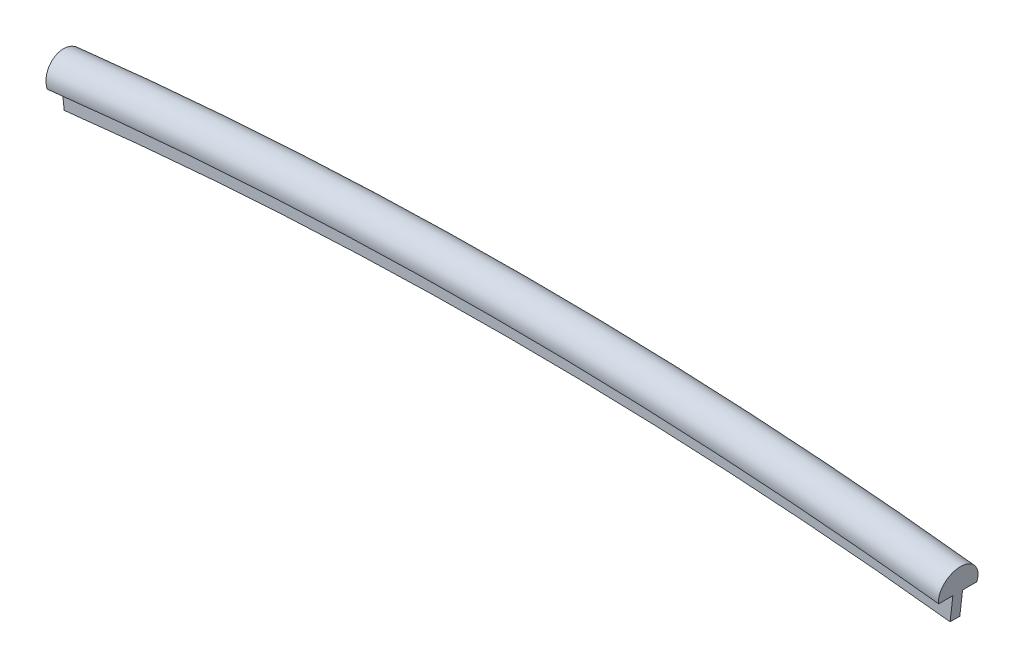
ISO-10303-21;
HEADER;
FILE_DESCRIPTION(('STEP AP214'),'2;1');
FILE_NAME('part.step','',(''),(''),'','','');
FILE_SCHEMA(('AUTOMOTIVE_DESIGN { 1 0 10303 214 1 1 1 1 }'));
ENDSEC;
DATA;
#1=APPLICATION_CONTEXT('core data for automotive mechanical design processes');
#2=APPLICATION_PROTOCOL_DEFINITION('international standard','automotive_design',2000,#1);
#3=PRODUCT_CONTEXT('',#1,'mechanical');
#4=PRODUCT('Part','Part','',(#3));
#5=PRODUCT_RELATED_PRODUCT_CATEGORY('part','',(#4));
#6=PRODUCT_DEFINITION_FORMATION('','',#4);
#7=PRODUCT_DEFINITION_CONTEXT('part definition',#1,'design');
#8=PRODUCT_DEFINITION('design','',#6,#7);
#9=PRODUCT_DEFINITION_SHAPE('','',#8);
#10=(LENGTH_UNIT() NAMED_UNIT(*) SI_UNIT(.MILLI.,.METRE.));
#11=(NAMED_UNIT(*) PLANE_ANGLE_UNIT() SI_UNIT($,.RADIAN.));
#12=(NAMED_UNIT(*) SI_UNIT($,.STERADIAN.) SOLID_ANGLE_UNIT());
#13=UNCERTAINTY_MEASURE_WITH_UNIT(LENGTH_MEASURE(1.E-05),#10,'distance_accuracy_value','');
#14=(GEOMETRIC_REPRESENTATION_CONTEXT(3) GLOBAL_UNCERTAINTY_ASSIGNED_CONTEXT((#13)) GLOBAL_UNIT_ASSIGNED_CONTEXT((#10,
#11,#12)) REPRESENTATION_CONTEXT('',''));
#15=CARTESIAN_POINT('',(0.,0.,0.));
#16=DIRECTION('',(0.,0.,1.));
#17=DIRECTION('',(1.,0.,0.));
#18=AXIS2_PLACEMENT_3D('',#15,#16,#17);
#19=CARTESIAN_POINT('',(0.,0.,70.5976415970385));
#20=DIRECTION('',(0.,0.,1.));
#21=DIRECTION('',(1.,0.,0.));
#22=AXIS2_PLACEMENT_3D('',#19,#20,#21);
#23=CYLINDRICAL_SURFACE('',#22,241.3);
#24=CARTESIAN_POINT('',(0.,0.,1.18));
#25=DIRECTION('',(0.,0.,1.));
#26=DIRECTION('',(1.,0.,0.));
#27=AXIS2_PLACEMENT_3D('',#24,#25,#26);
#28=CIRCLE('',#27,241.3);
#29=CARTESIAN_POINT('',(27.5796195249867,239.718698867771,1.18));
#30=VERTEX_POINT('',#29);
#31=CARTESIAN_POINT('',(-27.5796195249867,239.718698867771,1.18));
#32=VERTEX_POINT('',#31);
#33=EDGE_CURVE('E11',#30,#32,#28,.T.);
#34=ORIENTED_EDGE('',*,*,#33,.T.);
#35=DIRECTION('',(0.,0.,-1.));
#36=VECTOR('',#35,1.);
#37=CARTESIAN_POINT('',(-27.5796195249867,239.718698867771,1.18));
#38=LINE('',#37,#36);
#39=CARTESIAN_POINT('',(-27.5796195249867,239.718698867771,0.3));
#40=VERTEX_POINT('',#39);
#41=EDGE_CURVE('E103',#32,#40,#38,.T.);
#42=ORIENTED_EDGE('',*,*,#41,.T.);
#43=CARTESIAN_POINT('',(0.,0.,0.299999999999995));
#44=DIRECTION('',(0.,0.,1.));
#45=DIRECTION('',(1.,0.,0.));
#46=AXIS2_PLACEMENT_3D('',#43,#44,#45);
#47=CIRCLE('',#46,241.3);
#48=CARTESIAN_POINT('',(27.5796195249867,239.718698867771,0.3));
#49=VERTEX_POINT('',#48);
#50=EDGE_CURVE('E85',#49,#40,#47,.T.);
#51=ORIENTED_EDGE('',*,*,#50,.F.);
#52=DIRECTION('',(0.,0.,-1.));
#53=VECTOR('',#52,1.);
#54=CARTESIAN_POINT('',(27.5796195249867,239.718698867771,1.18));
#55=LINE('',#54,#53);
#56=EDGE_CURVE('E117',#30,#49,#55,.T.);
#57=ORIENTED_EDGE('',*,*,#56,.F.);
#58=EDGE_LOOP('',(#34,#42,#51,#57));
#59=FACE_BOUND('',#58,.T.);
#60=ADVANCED_FACE('F33',(#59),#23,.F.);
#61=CARTESIAN_POINT('',(0.,0.,0.));
#62=DIRECTION('',(0.,0.,1.));
#63=DIRECTION('',(1.,0.,0.));
#64=AXIS2_PLACEMENT_3D('',#61,#62,#63);
#65=TOROIDAL_SURFACE('',#64,241.586013989906,1.21416802890791);
#66=CARTESIAN_POINT('',(0.,0.,-1.18));
#67=DIRECTION('',(0.,0.,1.));
#68=DIRECTION('',(1.,0.,0.));
#69=AXIS2_PLACEMENT_3D('',#66,#67,#68);
#70=CIRCLE('',#69,241.3);
#71=CARTESIAN_POINT('',(27.5796195249867,239.718698867771,-1.18));
#72=VERTEX_POINT('',#71);
#73=CARTESIAN_POINT('',(-27.5796195249867,239.718698867771,-1.18));
#74=VERTEX_POINT('',#73);
#75=EDGE_CURVE('E41',#72,#74,#70,.T.);
#76=ORIENTED_EDGE('',*,*,#75,.T.);
#77=CARTESIAN_POINT('',(-27.6123097737245,240.002838534237,0.));
#78=DIRECTION('',(0.993446742096025,0.114295978139191,0.));
#79=DIRECTION('',(0.,0.,1.));
#80=AXIS2_PLACEMENT_3D('',#77,#78,#79);
#81=CIRCLE('',#80,1.21416802890791);
#82=EDGE_CURVE('E115',#74,#32,#81,.T.);
#83=ORIENTED_EDGE('',*,*,#82,.T.);
#84=ORIENTED_EDGE('',*,*,#33,.F.);
#85=CARTESIAN_POINT('',(27.6123097737245,240.002838534237,0.));
#86=DIRECTION('',(0.993446742096025,-0.114295978139191,0.));
#87=DIRECTION('',(0.,0.,1.));
#88=AXIS2_PLACEMENT_3D('',#85,#86,#87);
#89=CIRCLE('',#88,1.21416802890791);
#90=EDGE_CURVE('E97',#72,#30,#89,.T.);
#91=ORIENTED_EDGE('',*,*,#90,.F.);
#92=EDGE_LOOP('',(#76,#83,#84,#91));
#93=FACE_BOUND('',#92,.T.);
#94=ADVANCED_FACE('F35',(#93),#65,.T.);
#95=CARTESIAN_POINT('',(0.,0.,70.5976415970385));
#96=DIRECTION('',(0.,0.,1.));
#97=DIRECTION('',(1.,0.,0.));
#98=AXIS2_PLACEMENT_3D('',#95,#96,#97);
#99=CYLINDRICAL_SURFACE('',#98,241.3);
#100=CARTESIAN_POINT('',(0.,0.,-0.299999999999995));
#101=DIRECTION('',(0.,0.,1.));
#102=DIRECTION('',(1.,0.,0.));
#103=AXIS2_PLACEMENT_3D('',#100,#101,#102);
#104=CIRCLE('',#103,241.3);
#105=CARTESIAN_POINT('',(27.5796195249867,239.718698867771,-0.3));
#106=VERTEX_POINT('',#105);
#107=CARTESIAN_POINT('',(-27.5796195249867,239.718698867771,-0.3));
#108=VERTEX_POINT('',#107);
#109=EDGE_CURVE('E132',#106,#108,#104,.T.);
#110=ORIENTED_EDGE('',*,*,#109,.T.);
#111=DIRECTION('',(0.,0.,-1.));
#112=VECTOR('',#111,1.);
#113=CARTESIAN_POINT('',(-27.5796195249867,239.718698867771,-0.3));
#114=LINE('',#113,#112);
#115=EDGE_CURVE('E113',#108,#74,#114,.T.);
#116=ORIENTED_EDGE('',*,*,#115,.T.);
#117=ORIENTED_EDGE('',*,*,#75,.F.);
#118=DIRECTION('',(0.,0.,-1.));
#119=VECTOR('',#118,1.);
#120=CARTESIAN_POINT('',(27.5796195249867,239.718698867771,-0.3));
#121=LINE('',#120,#119);
#122=EDGE_CURVE('E125',#106,#72,#121,.T.);
#123=ORIENTED_EDGE('',*,*,#122,.F.);
#124=EDGE_LOOP('',(#110,#116,#117,#123));
#125=FACE_BOUND('',#124,.T.);
#126=ADVANCED_FACE('F134',(#125),#99,.F.);
#127=CARTESIAN_POINT('',(27.4081755577779,238.228528754627,-0.3));
#128=DIRECTION('',(0.,0.,1.));
#129=DIRECTION('',(1.,0.,0.));
#130=AXIS2_PLACEMENT_3D('',#127,#128,#129);
#131=PLANE('',#130);
#132=CARTESIAN_POINT('',(0.,0.,-0.299999999999995));
#133=DIRECTION('',(0.,0.,1.));
#134=DIRECTION('',(1.,0.,0.));
#135=AXIS2_PLACEMENT_3D('',#132,#133,#134);
#136=CIRCLE('',#135,239.8);
#137=CARTESIAN_POINT('',(27.4081755577779,238.228528754627,-0.3));
#138=VERTEX_POINT('',#137);
#139=CARTESIAN_POINT('',(-27.4081755577779,238.228528754627,-0.3));
#140=VERTEX_POINT('',#139);
#141=EDGE_CURVE('E129',#138,#140,#136,.T.);
#142=ORIENTED_EDGE('',*,*,#141,.T.);
#143=DIRECTION('',(-0.114295978139191,0.993446742096025,0.));
#144=VECTOR('',#143,1.);
#145=CARTESIAN_POINT('',(-27.4081755577779,238.228528754627,-0.3));
#146=LINE('',#145,#144);
#147=EDGE_CURVE('E110',#140,#108,#146,.T.);
#148=ORIENTED_EDGE('',*,*,#147,.T.);
#149=ORIENTED_EDGE('',*,*,#109,.F.);
#150=DIRECTION('',(0.114295978139191,0.993446742096025,0.));
#151=VECTOR('',#150,1.);
#152=CARTESIAN_POINT('',(27.4081755577779,238.228528754627,-0.3));
#153=LINE('',#152,#151);
#154=EDGE_CURVE('E122',#138,#106,#153,.T.);
#155=ORIENTED_EDGE('',*,*,#154,.F.);
#156=EDGE_LOOP('',(#142,#148,#149,#155));
#157=FACE_BOUND('',#156,.T.);
#158=ADVANCED_FACE('F136',(#157),#131,.F.);
#159=CARTESIAN_POINT('',(0.,0.,70.5976415970385));
#160=DIRECTION('',(0.,0.,1.));
#161=DIRECTION('',(1.,0.,0.));
#162=AXIS2_PLACEMENT_3D('',#159,#160,#161);
#163=CYLINDRICAL_SURFACE('',#162,239.8);
#164=CARTESIAN_POINT('',(0.,0.,0.299999999999995));
#165=DIRECTION('',(0.,0.,1.));
#166=DIRECTION('',(1.,0.,0.));
#167=AXIS2_PLACEMENT_3D('',#164,#165,#166);
#168=CIRCLE('',#167,239.8);
#169=CARTESIAN_POINT('',(27.4081755577779,238.228528754627,0.3));
#170=VERTEX_POINT('',#169);
#171=CARTESIAN_POINT('',(-27.4081755577779,238.228528754627,0.3));
#172=VERTEX_POINT('',#171);
#173=EDGE_CURVE('E96',#170,#172,#168,.T.);
#174=ORIENTED_EDGE('',*,*,#173,.T.);
#175=DIRECTION('',(0.,0.,-1.));
#176=VECTOR('',#175,1.);
#177=CARTESIAN_POINT('',(-27.4081755577779,238.228528754627,0.));
#178=LINE('',#177,#176);
#179=EDGE_CURVE('E105',#172,#140,#178,.T.);
#180=ORIENTED_EDGE('',*,*,#179,.T.);
#181=ORIENTED_EDGE('',*,*,#141,.F.);
#182=DIRECTION('',(0.,0.,-1.));
#183=VECTOR('',#182,1.);
#184=CARTESIAN_POINT('',(27.4081755577779,238.228528754627,0.));
#185=LINE('',#184,#183);
#186=EDGE_CURVE('E120',#170,#138,#185,.T.);
#187=ORIENTED_EDGE('',*,*,#186,.F.);
#188=EDGE_LOOP('',(#174,#180,#181,#187));
#189=FACE_BOUND('',#188,.T.);
#190=ADVANCED_FACE('F141',(#189),#163,.F.);
#191=CARTESIAN_POINT('',(27.4081755577779,238.228528754627,0.3));
#192=DIRECTION('',(0.,0.,-1.));
#193=DIRECTION('',(-1.,0.,0.));
#194=AXIS2_PLACEMENT_3D('',#191,#192,#193);
#195=PLANE('',#194);
#196=DIRECTION('',(-0.114295978139191,-0.993446742096025,0.));
#197=VECTOR('',#196,1.);
#198=CARTESIAN_POINT('',(27.4081755577779,238.228528754627,0.3));
#199=LINE('',#198,#197);
#200=EDGE_CURVE('E91',#49,#170,#199,.T.);
#201=ORIENTED_EDGE('',*,*,#200,.F.);
#202=ORIENTED_EDGE('',*,*,#50,.T.);
#203=DIRECTION('',(0.114295978139191,-0.993446742096025,0.));
#204=VECTOR('',#203,1.);
#205=CARTESIAN_POINT('',(-27.4081755577779,238.228528754627,0.3));
#206=LINE('',#205,#204);
#207=EDGE_CURVE('E88',#40,#172,#206,.T.);
#208=ORIENTED_EDGE('',*,*,#207,.T.);
#209=ORIENTED_EDGE('',*,*,#173,.F.);
#210=EDGE_LOOP('',(#201,#202,#208,#209));
#211=FACE_BOUND('',#210,.T.);
#212=ADVANCED_FACE('F87',(#211),#195,.F.);
#213=CARTESIAN_POINT('',(27.6123097737245,240.002838534237,0.));
#214=DIRECTION('',(-0.993446742096025,0.114295978139191,0.));
#215=DIRECTION('',(0.,0.,1.));
#216=AXIS2_PLACEMENT_3D('',#213,#214,#215);
#217=PLANE('',#216);
#218=ORIENTED_EDGE('',*,*,#56,.T.);
#219=ORIENTED_EDGE('',*,*,#200,.T.);
#220=ORIENTED_EDGE('',*,*,#186,.T.);
#221=ORIENTED_EDGE('',*,*,#154,.T.);
#222=ORIENTED_EDGE('',*,*,#122,.T.);
#223=ORIENTED_EDGE('',*,*,#90,.T.);
#224=EDGE_LOOP('',(#218,#219,#220,#221,#222,#223));
#225=FACE_BOUND('',#224,.T.);
#226=ADVANCED_FACE('F143',(#225),#217,.F.);
#227=CARTESIAN_POINT('',(-27.6123097737245,240.002838534237,0.));
#228=DIRECTION('',(-0.993446742096025,-0.114295978139191,0.));
#229=DIRECTION('',(0.,0.,1.));
#230=AXIS2_PLACEMENT_3D('',#227,#228,#229);
#231=PLANE('',#230);
#232=ORIENTED_EDGE('',*,*,#41,.F.);
#233=ORIENTED_EDGE('',*,*,#82,.F.);
#234=ORIENTED_EDGE('',*,*,#115,.F.);
#235=ORIENTED_EDGE('',*,*,#147,.F.);
#236=ORIENTED_EDGE('',*,*,#179,.F.);
#237=ORIENTED_EDGE('',*,*,#207,.F.);
#238=EDGE_LOOP('',(#232,#233,#234,#235,#236,#237));
#239=FACE_BOUND('',#238,.T.);
#240=ADVANCED_FACE('F101',(#239),#231,.T.);
#241=CLOSED_SHELL('',(#60,#94,#126,#158,#190,#212,#226,#240));
#242=MANIFOLD_SOLID_BREP('B2',#241);
#243=ADVANCED_BREP_SHAPE_REPRESENTATION('',(#18,#242),#14);
#244=SHAPE_DEFINITION_REPRESENTATION(#9,#243);
ENDSEC;
END-ISO-10303-21;
